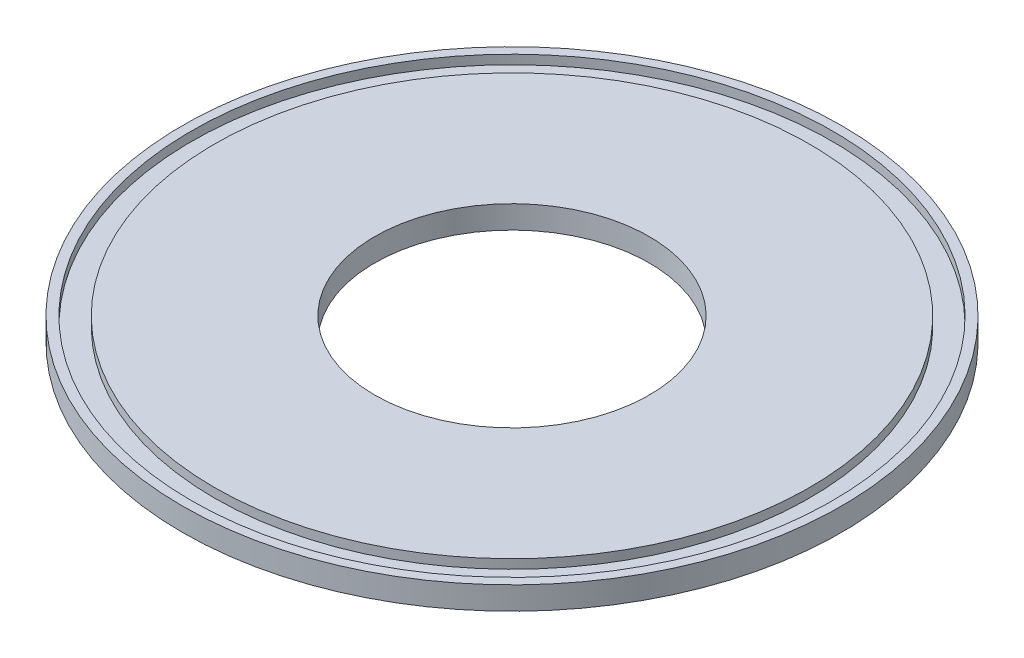
ISO-10303-21;
HEADER;
FILE_DESCRIPTION(('STEP AP214'),'2;1');
FILE_NAME('part.step','',(''),(''),'','','');
FILE_SCHEMA(('AUTOMOTIVE_DESIGN { 1 0 10303 214 1 1 1 1 }'));
ENDSEC;
DATA;
#1=APPLICATION_CONTEXT('core data for automotive mechanical design processes');
#2=APPLICATION_PROTOCOL_DEFINITION('international standard','automotive_design',2000,#1);
#3=PRODUCT_CONTEXT('',#1,'mechanical');
#4=PRODUCT('Part','Part','',(#3));
#5=PRODUCT_RELATED_PRODUCT_CATEGORY('part','',(#4));
#6=PRODUCT_DEFINITION_FORMATION('','',#4);
#7=PRODUCT_DEFINITION_CONTEXT('part definition',#1,'design');
#8=PRODUCT_DEFINITION('design','',#6,#7);
#9=PRODUCT_DEFINITION_SHAPE('','',#8);
#10=(LENGTH_UNIT() NAMED_UNIT(*) SI_UNIT(.MILLI.,.METRE.));
#11=(NAMED_UNIT(*) PLANE_ANGLE_UNIT() SI_UNIT($,.RADIAN.));
#12=(NAMED_UNIT(*) SI_UNIT($,.STERADIAN.) SOLID_ANGLE_UNIT());
#13=UNCERTAINTY_MEASURE_WITH_UNIT(LENGTH_MEASURE(1.E-05),#10,'distance_accuracy_value','');
#14=(GEOMETRIC_REPRESENTATION_CONTEXT(3) GLOBAL_UNCERTAINTY_ASSIGNED_CONTEXT((#13)) GLOBAL_UNIT_ASSIGNED_CONTEXT((#10,
#11,#12)) REPRESENTATION_CONTEXT('',''));
#15=CARTESIAN_POINT('',(0.,0.,0.));
#16=DIRECTION('',(0.,0.,1.));
#17=DIRECTION('',(1.,0.,0.));
#18=AXIS2_PLACEMENT_3D('',#15,#16,#17);
#19=CARTESIAN_POINT('',(0.,12.5,0.));
#20=DIRECTION('',(0.,1.,0.));
#21=DIRECTION('',(0.,0.,1.));
#22=AXIS2_PLACEMENT_3D('',#19,#20,#21);
#23=PLANE('',#22);
#24=CARTESIAN_POINT('',(0.,12.5,0.));
#25=DIRECTION('',(0.,1.,0.));
#26=DIRECTION('',(0.,0.,1.));
#27=AXIS2_PLACEMENT_3D('',#24,#25,#26);
#28=CIRCLE('',#27,150.);
#29=CARTESIAN_POINT('',(0.,12.5,150.));
#30=VERTEX_POINT('',#29);
#31=EDGE_CURVE('E42',#30,#30,#28,.T.);
#32=ORIENTED_EDGE('',*,*,#31,.F.);
#33=EDGE_LOOP('',(#32));
#34=FACE_BOUND('',#33,.T.);
#35=CARTESIAN_POINT('',(0.,12.5,0.));
#36=DIRECTION('',(0.,1.,0.));
#37=DIRECTION('',(0.,0.,1.));
#38=AXIS2_PLACEMENT_3D('',#35,#36,#37);
#39=CIRCLE('',#38,325.);
#40=CARTESIAN_POINT('',(0.,12.5,325.));
#41=VERTEX_POINT('',#40);
#42=EDGE_CURVE('E56',#41,#41,#39,.T.);
#43=ORIENTED_EDGE('',*,*,#42,.T.);
#44=EDGE_LOOP('',(#43));
#45=FACE_BOUND('',#44,.T.);
#46=ADVANCED_FACE('F31',(#34,#45),#23,.T.);
#47=CARTESIAN_POINT('',(0.,12.5,0.));
#48=DIRECTION('',(0.,1.,0.));
#49=DIRECTION('',(0.,0.,1.));
#50=AXIS2_PLACEMENT_3D('',#47,#48,#49);
#51=CIRCLE('',#50,350.);
#52=CARTESIAN_POINT('',(0.,12.5,350.));
#53=VERTEX_POINT('',#52);
#54=EDGE_CURVE('E50',#53,#53,#51,.T.);
#55=ORIENTED_EDGE('',*,*,#54,.F.);
#56=EDGE_LOOP('',(#55));
#57=FACE_BOUND('',#56,.T.);
#58=CARTESIAN_POINT('',(0.,12.5,0.));
#59=DIRECTION('',(0.,1.,0.));
#60=DIRECTION('',(0.,0.,1.));
#61=AXIS2_PLACEMENT_3D('',#58,#59,#60);
#62=CIRCLE('',#61,360.);
#63=CARTESIAN_POINT('',(0.,12.5,360.));
#64=VERTEX_POINT('',#63);
#65=EDGE_CURVE('E10',#64,#64,#62,.T.);
#66=ORIENTED_EDGE('',*,*,#65,.T.);
#67=EDGE_LOOP('',(#66));
#68=FACE_BOUND('',#67,.T.);
#69=ADVANCED_FACE('F78',(#57,#68),#23,.T.);
#70=CARTESIAN_POINT('',(0.,-12.5,0.));
#71=DIRECTION('',(0.,1.,0.));
#72=DIRECTION('',(0.,0.,1.));
#73=AXIS2_PLACEMENT_3D('',#70,#71,#72);
#74=PLANE('',#73);
#75=CARTESIAN_POINT('',(0.,-12.5,0.));
#76=DIRECTION('',(0.,1.,0.));
#77=DIRECTION('',(0.,0.,1.));
#78=AXIS2_PLACEMENT_3D('',#75,#76,#77);
#79=CIRCLE('',#78,360.);
#80=CARTESIAN_POINT('',(0.,-12.5,360.));
#81=VERTEX_POINT('',#80);
#82=EDGE_CURVE('E35',#81,#81,#79,.T.);
#83=ORIENTED_EDGE('',*,*,#82,.F.);
#84=EDGE_LOOP('',(#83));
#85=FACE_BOUND('',#84,.T.);
#86=CARTESIAN_POINT('',(0.,-12.5,0.));
#87=DIRECTION('',(0.,1.,0.));
#88=DIRECTION('',(0.,0.,1.));
#89=AXIS2_PLACEMENT_3D('',#86,#87,#88);
#90=CIRCLE('',#89,150.);
#91=CARTESIAN_POINT('',(0.,-12.5,150.));
#92=VERTEX_POINT('',#91);
#93=EDGE_CURVE('E44',#92,#92,#90,.T.);
#94=ORIENTED_EDGE('',*,*,#93,.T.);
#95=EDGE_LOOP('',(#94));
#96=FACE_BOUND('',#95,.T.);
#97=ADVANCED_FACE('F80',(#85,#96),#74,.F.);
#98=CARTESIAN_POINT('',(0.,12.5,0.));
#99=DIRECTION('',(0.,-1.,0.));
#100=DIRECTION('',(0.,0.,-1.));
#101=AXIS2_PLACEMENT_3D('',#98,#99,#100);
#102=CYLINDRICAL_SURFACE('',#101,360.);
#103=ORIENTED_EDGE('',*,*,#65,.F.);
#104=EDGE_LOOP('',(#103));
#105=FACE_BOUND('',#104,.T.);
#106=ORIENTED_EDGE('',*,*,#82,.T.);
#107=EDGE_LOOP('',(#106));
#108=FACE_BOUND('',#107,.T.);
#109=ADVANCED_FACE('F33',(#105,#108),#102,.T.);
#110=CARTESIAN_POINT('',(0.,12.5,0.));
#111=DIRECTION('',(0.,-1.,0.));
#112=DIRECTION('',(0.,0.,-1.));
#113=AXIS2_PLACEMENT_3D('',#110,#111,#112);
#114=CYLINDRICAL_SURFACE('',#113,150.);
#115=ORIENTED_EDGE('',*,*,#31,.T.);
#116=EDGE_LOOP('',(#115));
#117=FACE_BOUND('',#116,.T.);
#118=ORIENTED_EDGE('',*,*,#93,.F.);
#119=EDGE_LOOP('',(#118));
#120=FACE_BOUND('',#119,.T.);
#121=ADVANCED_FACE('F74',(#117,#120),#114,.F.);
#122=CARTESIAN_POINT('',(0.,2.5,0.));
#123=DIRECTION('',(0.,1.,0.));
#124=DIRECTION('',(0.,0.,1.));
#125=AXIS2_PLACEMENT_3D('',#122,#123,#124);
#126=CYLINDRICAL_SURFACE('',#125,350.);
#127=CARTESIAN_POINT('',(0.,2.5,0.));
#128=DIRECTION('',(0.,1.,0.));
#129=DIRECTION('',(0.,0.,1.));
#130=AXIS2_PLACEMENT_3D('',#127,#128,#129);
#131=CIRCLE('',#130,350.);
#132=CARTESIAN_POINT('',(0.,2.5,350.));
#133=VERTEX_POINT('',#132);
#134=EDGE_CURVE('E47',#133,#133,#131,.T.);
#135=ORIENTED_EDGE('',*,*,#134,.F.);
#136=EDGE_LOOP('',(#135));
#137=FACE_BOUND('',#136,.T.);
#138=ORIENTED_EDGE('',*,*,#54,.T.);
#139=EDGE_LOOP('',(#138));
#140=FACE_BOUND('',#139,.T.);
#141=ADVANCED_FACE('F68',(#137,#140),#126,.F.);
#142=CARTESIAN_POINT('',(0.,2.5,0.));
#143=DIRECTION('',(0.,1.,0.));
#144=DIRECTION('',(0.,0.,1.));
#145=AXIS2_PLACEMENT_3D('',#142,#143,#144);
#146=PLANE('',#145);
#147=CARTESIAN_POINT('',(0.,2.5,0.));
#148=DIRECTION('',(0.,1.,0.));
#149=DIRECTION('',(0.,0.,1.));
#150=AXIS2_PLACEMENT_3D('',#147,#148,#149);
#151=CIRCLE('',#150,325.);
#152=CARTESIAN_POINT('',(0.,2.5,325.));
#153=VERTEX_POINT('',#152);
#154=EDGE_CURVE('E53',#153,#153,#151,.T.);
#155=ORIENTED_EDGE('',*,*,#154,.F.);
#156=EDGE_LOOP('',(#155));
#157=FACE_BOUND('',#156,.T.);
#158=ORIENTED_EDGE('',*,*,#134,.T.);
#159=EDGE_LOOP('',(#158));
#160=FACE_BOUND('',#159,.T.);
#161=ADVANCED_FACE('F65',(#157,#160),#146,.T.);
#162=CARTESIAN_POINT('',(0.,2.5,0.));
#163=DIRECTION('',(0.,1.,0.));
#164=DIRECTION('',(0.,0.,1.));
#165=AXIS2_PLACEMENT_3D('',#162,#163,#164);
#166=CYLINDRICAL_SURFACE('',#165,325.);
#167=ORIENTED_EDGE('',*,*,#154,.T.);
#168=EDGE_LOOP('',(#167));
#169=FACE_BOUND('',#168,.T.);
#170=ORIENTED_EDGE('',*,*,#42,.F.);
#171=EDGE_LOOP('',(#170));
#172=FACE_BOUND('',#171,.T.);
#173=ADVANCED_FACE('F62',(#169,#172),#166,.T.);
#174=CLOSED_SHELL('',(#46,#69,#97,#109,#121,#141,#161,#173));
#175=MANIFOLD_SOLID_BREP('B2',#174);
#176=ADVANCED_BREP_SHAPE_REPRESENTATION('',(#18,#175),#14);
#177=SHAPE_DEFINITION_REPRESENTATION(#9,#176);
ENDSEC;
END-ISO-10303-21;
